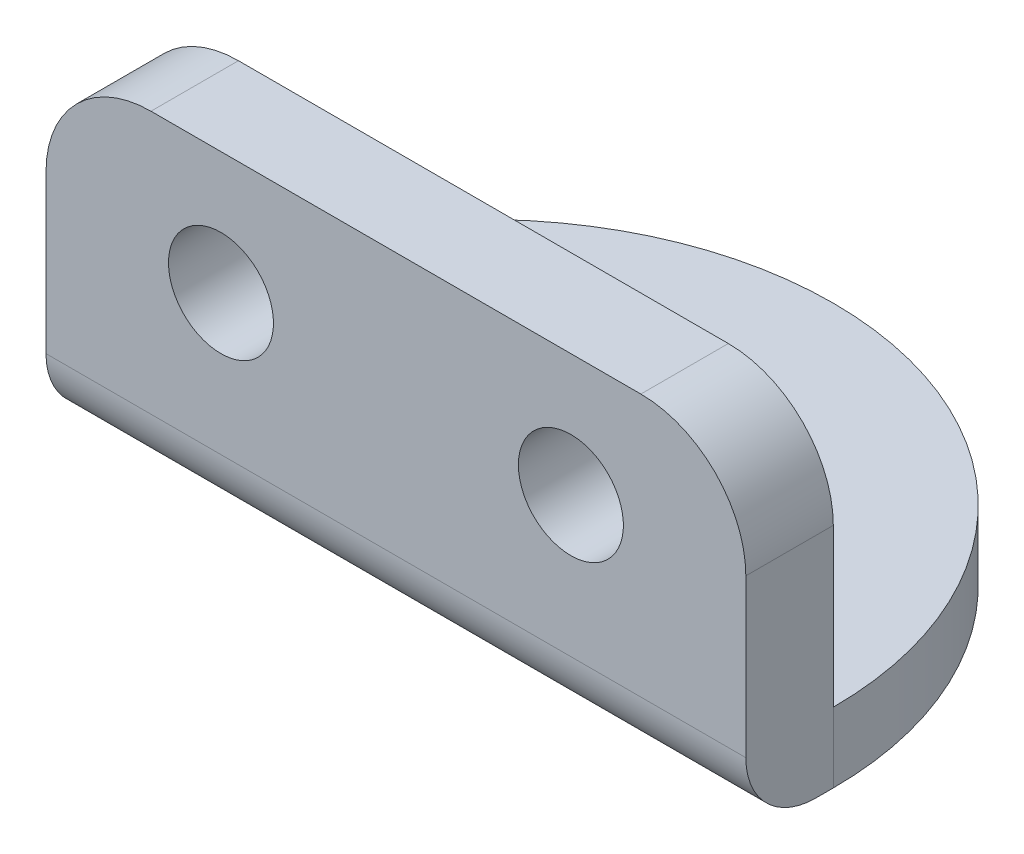
ISO-10303-21;
HEADER;
FILE_DESCRIPTION(('STEP AP214'),'2;1');
FILE_NAME('part.step','',(''),(''),'','','');
FILE_SCHEMA(('AUTOMOTIVE_DESIGN { 1 0 10303 214 1 1 1 1 }'));
ENDSEC;
DATA;
#1=APPLICATION_CONTEXT('core data for automotive mechanical design processes');
#2=APPLICATION_PROTOCOL_DEFINITION('international standard','automotive_design',2000,#1);
#3=PRODUCT_CONTEXT('',#1,'mechanical');
#4=PRODUCT('Part','Part','',(#3));
#5=PRODUCT_RELATED_PRODUCT_CATEGORY('part','',(#4));
#6=PRODUCT_DEFINITION_FORMATION('','',#4);
#7=PRODUCT_DEFINITION_CONTEXT('part definition',#1,'design');
#8=PRODUCT_DEFINITION('design','',#6,#7);
#9=PRODUCT_DEFINITION_SHAPE('','',#8);
#10=(LENGTH_UNIT() NAMED_UNIT(*) SI_UNIT(.MILLI.,.METRE.));
#11=(NAMED_UNIT(*) PLANE_ANGLE_UNIT() SI_UNIT($,.RADIAN.));
#12=(NAMED_UNIT(*) SI_UNIT($,.STERADIAN.) SOLID_ANGLE_UNIT());
#13=UNCERTAINTY_MEASURE_WITH_UNIT(LENGTH_MEASURE(1.E-05),#10,'distance_accuracy_value','');
#14=(GEOMETRIC_REPRESENTATION_CONTEXT(3) GLOBAL_UNCERTAINTY_ASSIGNED_CONTEXT((#13)) GLOBAL_UNIT_ASSIGNED_CONTEXT((#10,
#11,#12)) REPRESENTATION_CONTEXT('',''));
#15=CARTESIAN_POINT('',(0.,0.,0.));
#16=DIRECTION('',(0.,0.,1.));
#17=DIRECTION('',(1.,0.,0.));
#18=AXIS2_PLACEMENT_3D('',#15,#16,#17);
#19=CARTESIAN_POINT('',(0.,2.,0.));
#20=DIRECTION('',(0.,-1.,0.));
#21=DIRECTION('',(0.,0.,-1.));
#22=AXIS2_PLACEMENT_3D('',#19,#20,#21);
#23=CYLINDRICAL_SURFACE('',#22,1.5);
#24=CARTESIAN_POINT('',(0.,2.,0.));
#25=DIRECTION('',(0.,1.,0.));
#26=DIRECTION('',(0.,0.,1.));
#27=AXIS2_PLACEMENT_3D('',#24,#25,#26);
#28=CIRCLE('',#27,1.5);
#29=CARTESIAN_POINT('',(0.,2.,1.5));
#30=VERTEX_POINT('',#29);
#31=EDGE_CURVE('E129',#30,#30,#28,.T.);
#32=ORIENTED_EDGE('',*,*,#31,.T.);
#33=EDGE_LOOP('',(#32));
#34=FACE_BOUND('',#33,.T.);
#35=CARTESIAN_POINT('',(0.,0.,0.));
#36=DIRECTION('',(0.,1.,0.));
#37=DIRECTION('',(0.,0.,1.));
#38=AXIS2_PLACEMENT_3D('',#35,#36,#37);
#39=CIRCLE('',#38,1.5);
#40=CARTESIAN_POINT('',(0.,0.,1.5));
#41=VERTEX_POINT('',#40);
#42=EDGE_CURVE('E130',#41,#41,#39,.T.);
#43=ORIENTED_EDGE('',*,*,#42,.F.);
#44=EDGE_LOOP('',(#43));
#45=FACE_BOUND('',#44,.T.);
#46=ADVANCED_FACE('F41',(#34,#45),#23,.F.);
#47=CARTESIAN_POINT('',(-2.40947920630197E-13,2.,3.23));
#48=DIRECTION('',(0.,-1.,0.));
#49=DIRECTION('',(0.,0.,-1.));
#50=AXIS2_PLACEMENT_3D('',#47,#48,#49);
#51=CYLINDRICAL_SURFACE('',#50,10.0000000000001);
#52=CARTESIAN_POINT('',(-2.40947920630197E-13,0.,3.23));
#53=DIRECTION('',(0.,1.,0.));
#54=DIRECTION('',(0.,0.,1.));
#55=AXIS2_PLACEMENT_3D('',#52,#53,#54);
#56=CIRCLE('',#55,10.0000000000001);
#57=CARTESIAN_POINT('',(10.0000000000001,0.,3.23));
#58=VERTEX_POINT('',#57);
#59=CARTESIAN_POINT('',(-10.0000000000001,0.,3.23));
#60=VERTEX_POINT('',#59);
#61=EDGE_CURVE('E118',#58,#60,#56,.T.);
#62=ORIENTED_EDGE('',*,*,#61,.T.);
#63=DIRECTION('',(0.,-1.,0.));
#64=VECTOR('',#63,1.);
#65=CARTESIAN_POINT('',(-10.0000000000001,2.,3.23));
#66=LINE('',#65,#64);
#67=CARTESIAN_POINT('',(-10.0000000000001,2.,3.23));
#68=VERTEX_POINT('',#67);
#69=EDGE_CURVE('E125',#68,#60,#66,.T.);
#70=ORIENTED_EDGE('',*,*,#69,.F.);
#71=CARTESIAN_POINT('',(-2.40947920630197E-13,2.,3.23));
#72=DIRECTION('',(0.,1.,0.));
#73=DIRECTION('',(0.,0.,1.));
#74=AXIS2_PLACEMENT_3D('',#71,#72,#73);
#75=CIRCLE('',#74,10.0000000000001);
#76=CARTESIAN_POINT('',(10.0000000000001,2.,3.23));
#77=VERTEX_POINT('',#76);
#78=EDGE_CURVE('E121',#77,#68,#75,.T.);
#79=ORIENTED_EDGE('',*,*,#78,.F.);
#80=DIRECTION('',(0.,-1.,0.));
#81=VECTOR('',#80,1.);
#82=CARTESIAN_POINT('',(10.0000000000001,2.,3.23));
#83=LINE('',#82,#81);
#84=EDGE_CURVE('E108',#77,#58,#83,.T.);
#85=ORIENTED_EDGE('',*,*,#84,.T.);
#86=EDGE_LOOP('',(#62,#70,#79,#85));
#87=FACE_BOUND('',#86,.T.);
#88=ADVANCED_FACE('F116',(#87),#51,.T.);
#89=CARTESIAN_POINT('',(0.,2.,0.));
#90=DIRECTION('',(0.,1.,0.));
#91=DIRECTION('',(0.,0.,1.));
#92=AXIS2_PLACEMENT_3D('',#89,#90,#91);
#93=PLANE('',#92);
#94=ORIENTED_EDGE('',*,*,#31,.F.);
#95=EDGE_LOOP('',(#94));
#96=FACE_BOUND('',#95,.T.);
#97=DIRECTION('',(1.,0.,0.));
#98=VECTOR('',#97,1.);
#99=CARTESIAN_POINT('',(0.,2.,3.23));
#100=LINE('',#99,#98);
#101=EDGE_CURVE('E135',#68,#77,#100,.T.);
#102=ORIENTED_EDGE('',*,*,#101,.T.);
#103=ORIENTED_EDGE('',*,*,#78,.T.);
#104=EDGE_LOOP('',(#102,#103));
#105=FACE_BOUND('',#104,.T.);
#106=ADVANCED_FACE('F269',(#96,#105),#93,.T.);
#107=CARTESIAN_POINT('',(0.,0.,0.));
#108=DIRECTION('',(0.,1.,0.));
#109=DIRECTION('',(0.,0.,1.));
#110=AXIS2_PLACEMENT_3D('',#107,#108,#109);
#111=PLANE('',#110);
#112=ORIENTED_EDGE('',*,*,#42,.T.);
#113=EDGE_LOOP('',(#112));
#114=FACE_BOUND('',#113,.T.);
#115=DIRECTION('',(0.,0.,-1.));
#116=VECTOR('',#115,1.);
#117=CARTESIAN_POINT('',(10.0000000000001,0.,0.));
#118=LINE('',#117,#116);
#119=CARTESIAN_POINT('',(10.0000000000001,0.,3.73));
#120=VERTEX_POINT('',#119);
#121=EDGE_CURVE('E104',#120,#58,#118,.T.);
#122=ORIENTED_EDGE('',*,*,#121,.F.);
#123=DIRECTION('',(1.,0.,0.));
#124=VECTOR('',#123,1.);
#125=CARTESIAN_POINT('',(0.,0.,3.73));
#126=LINE('',#125,#124);
#127=CARTESIAN_POINT('',(-10.0000000000001,0.,3.73));
#128=VERTEX_POINT('',#127);
#129=EDGE_CURVE('E50',#120,#128,#126,.F.);
#130=ORIENTED_EDGE('',*,*,#129,.T.);
#131=DIRECTION('',(0.,0.,1.));
#132=VECTOR('',#131,1.);
#133=CARTESIAN_POINT('',(-10.0000000000001,0.,0.));
#134=LINE('',#133,#132);
#135=EDGE_CURVE('E112',#60,#128,#134,.T.);
#136=ORIENTED_EDGE('',*,*,#135,.F.);
#137=ORIENTED_EDGE('',*,*,#61,.F.);
#138=EDGE_LOOP('',(#122,#130,#136,#137));
#139=FACE_BOUND('',#138,.T.);
#140=ADVANCED_FACE('F127',(#114,#139),#111,.F.);
#141=CARTESIAN_POINT('',(0.,9.5,3.23));
#142=DIRECTION('',(0.,0.,-1.));
#143=DIRECTION('',(-1.,0.,0.));
#144=AXIS2_PLACEMENT_3D('',#141,#142,#143);
#145=PLANE('',#144);
#146=CARTESIAN_POINT('',(-5.,6.00000000000001,3.23));
#147=DIRECTION('',(0.,0.,-1.));
#148=DIRECTION('',(-1.,0.,0.));
#149=AXIS2_PLACEMENT_3D('',#146,#147,#148);
#150=CIRCLE('',#149,1.5);
#151=CARTESIAN_POINT('',(-6.5,6.00000000000001,3.23));
#152=VERTEX_POINT('',#151);
#153=EDGE_CURVE('E211',#152,#152,#150,.T.);
#154=ORIENTED_EDGE('',*,*,#153,.F.);
#155=EDGE_LOOP('',(#154));
#156=FACE_BOUND('',#155,.T.);
#157=CARTESIAN_POINT('',(5.,6.00000000000001,3.23));
#158=DIRECTION('',(0.,0.,-1.));
#159=DIRECTION('',(-1.,0.,0.));
#160=AXIS2_PLACEMENT_3D('',#157,#158,#159);
#161=CIRCLE('',#160,1.5);
#162=CARTESIAN_POINT('',(3.5,6.00000000000001,3.23));
#163=VERTEX_POINT('',#162);
#164=EDGE_CURVE('E203',#163,#163,#161,.T.);
#165=ORIENTED_EDGE('',*,*,#164,.F.);
#166=EDGE_LOOP('',(#165));
#167=FACE_BOUND('',#166,.T.);
#168=DIRECTION('',(1.,0.,0.));
#169=VECTOR('',#168,1.);
#170=CARTESIAN_POINT('',(0.,9.5,3.23));
#171=LINE('',#170,#169);
#172=CARTESIAN_POINT('',(-7.00000000000011,9.5,3.23));
#173=VERTEX_POINT('',#172);
#174=CARTESIAN_POINT('',(7.00000000000011,9.5,3.23));
#175=VERTEX_POINT('',#174);
#176=EDGE_CURVE('E111',#173,#175,#171,.T.);
#177=ORIENTED_EDGE('',*,*,#176,.T.);
#178=CARTESIAN_POINT('',(7.00000000000011,6.5,3.23));
#179=DIRECTION('',(0.,0.,-1.));
#180=DIRECTION('',(-1.,0.,0.));
#181=AXIS2_PLACEMENT_3D('',#178,#179,#180);
#182=CIRCLE('',#181,3.);
#183=CARTESIAN_POINT('',(10.0000000000001,6.5,3.23));
#184=VERTEX_POINT('',#183);
#185=EDGE_CURVE('E154',#175,#184,#182,.T.);
#186=ORIENTED_EDGE('',*,*,#185,.T.);
#187=DIRECTION('',(0.,-1.,0.));
#188=VECTOR('',#187,1.);
#189=CARTESIAN_POINT('',(10.0000000000001,9.5,3.23));
#190=LINE('',#189,#188);
#191=EDGE_CURVE('E190',#184,#77,#190,.T.);
#192=ORIENTED_EDGE('',*,*,#191,.T.);
#193=ORIENTED_EDGE('',*,*,#101,.F.);
#194=DIRECTION('',(0.,-1.,0.));
#195=VECTOR('',#194,1.);
#196=CARTESIAN_POINT('',(-10.0000000000001,9.5,3.23));
#197=LINE('',#196,#195);
#198=CARTESIAN_POINT('',(-10.0000000000001,6.5,3.23));
#199=VERTEX_POINT('',#198);
#200=EDGE_CURVE('E138',#199,#68,#197,.T.);
#201=ORIENTED_EDGE('',*,*,#200,.F.);
#202=CARTESIAN_POINT('',(-7.00000000000011,6.5,3.23));
#203=DIRECTION('',(0.,0.,-1.));
#204=DIRECTION('',(-1.,0.,0.));
#205=AXIS2_PLACEMENT_3D('',#202,#203,#204);
#206=CIRCLE('',#205,3.);
#207=EDGE_CURVE('E151',#199,#173,#206,.T.);
#208=ORIENTED_EDGE('',*,*,#207,.T.);
#209=EDGE_LOOP('',(#177,#186,#192,#193,#201,#208));
#210=FACE_BOUND('',#209,.T.);
#211=ADVANCED_FACE('F230',(#156,#167,#210),#145,.T.);
#212=CARTESIAN_POINT('',(-10.0000000000001,9.5,0.));
#213=DIRECTION('',(1.,0.,0.));
#214=DIRECTION('',(0.,0.,-1.));
#215=AXIS2_PLACEMENT_3D('',#212,#213,#214);
#216=PLANE('',#215);
#217=ORIENTED_EDGE('',*,*,#135,.T.);
#218=CARTESIAN_POINT('',(-10.0000000000001,2.,3.73));
#219=DIRECTION('',(1.,0.,0.));
#220=DIRECTION('',(0.,0.,-1.));
#221=AXIS2_PLACEMENT_3D('',#218,#219,#220);
#222=CIRCLE('',#221,2.);
#223=CARTESIAN_POINT('',(-10.0000000000001,2.,5.73));
#224=VERTEX_POINT('',#223);
#225=EDGE_CURVE('E11',#128,#224,#222,.F.);
#226=ORIENTED_EDGE('',*,*,#225,.T.);
#227=DIRECTION('',(0.,-1.,0.));
#228=VECTOR('',#227,1.);
#229=CARTESIAN_POINT('',(-10.0000000000001,9.5,5.73));
#230=LINE('',#229,#228);
#231=CARTESIAN_POINT('',(-10.0000000000001,6.5,5.73));
#232=VERTEX_POINT('',#231);
#233=EDGE_CURVE('E183',#232,#224,#230,.T.);
#234=ORIENTED_EDGE('',*,*,#233,.F.);
#235=DIRECTION('',(0.,0.,1.));
#236=VECTOR('',#235,1.);
#237=CARTESIAN_POINT('',(-10.0000000000001,6.5,3.23));
#238=LINE('',#237,#236);
#239=EDGE_CURVE('E166',#232,#199,#238,.F.);
#240=ORIENTED_EDGE('',*,*,#239,.T.);
#241=ORIENTED_EDGE('',*,*,#200,.T.);
#242=ORIENTED_EDGE('',*,*,#69,.T.);
#243=EDGE_LOOP('',(#217,#226,#234,#240,#241,#242));
#244=FACE_BOUND('',#243,.T.);
#245=ADVANCED_FACE('F233',(#244),#216,.F.);
#246=CARTESIAN_POINT('',(0.,9.5,5.73));
#247=DIRECTION('',(0.,0.,-1.));
#248=DIRECTION('',(-1.,0.,0.));
#249=AXIS2_PLACEMENT_3D('',#246,#247,#248);
#250=PLANE('',#249);
#251=CARTESIAN_POINT('',(-5.,6.00000000000001,5.73));
#252=DIRECTION('',(0.,0.,-1.));
#253=DIRECTION('',(-1.,0.,0.));
#254=AXIS2_PLACEMENT_3D('',#251,#252,#253);
#255=CIRCLE('',#254,1.5);
#256=CARTESIAN_POINT('',(-6.5,6.00000000000001,5.73));
#257=VERTEX_POINT('',#256);
#258=EDGE_CURVE('E196',#257,#257,#255,.T.);
#259=ORIENTED_EDGE('',*,*,#258,.T.);
#260=EDGE_LOOP('',(#259));
#261=FACE_BOUND('',#260,.T.);
#262=CARTESIAN_POINT('',(5.,6.00000000000001,5.73));
#263=DIRECTION('',(0.,0.,-1.));
#264=DIRECTION('',(-1.,0.,0.));
#265=AXIS2_PLACEMENT_3D('',#262,#263,#264);
#266=CIRCLE('',#265,1.5);
#267=CARTESIAN_POINT('',(3.5,6.00000000000001,5.73));
#268=VERTEX_POINT('',#267);
#269=EDGE_CURVE('E207',#268,#268,#266,.T.);
#270=ORIENTED_EDGE('',*,*,#269,.T.);
#271=EDGE_LOOP('',(#270));
#272=FACE_BOUND('',#271,.T.);
#273=ORIENTED_EDGE('',*,*,#233,.T.);
#274=DIRECTION('',(1.,0.,0.));
#275=VECTOR('',#274,1.);
#276=CARTESIAN_POINT('',(0.,2.,5.73));
#277=LINE('',#276,#275);
#278=CARTESIAN_POINT('',(10.0000000000001,2.,5.73));
#279=VERTEX_POINT('',#278);
#280=EDGE_CURVE('E169',#224,#279,#277,.T.);
#281=ORIENTED_EDGE('',*,*,#280,.T.);
#282=DIRECTION('',(0.,-1.,0.));
#283=VECTOR('',#282,1.);
#284=CARTESIAN_POINT('',(10.0000000000001,9.5,5.73));
#285=LINE('',#284,#283);
#286=CARTESIAN_POINT('',(10.0000000000001,6.5,5.73));
#287=VERTEX_POINT('',#286);
#288=EDGE_CURVE('E187',#287,#279,#285,.T.);
#289=ORIENTED_EDGE('',*,*,#288,.F.);
#290=CARTESIAN_POINT('',(7.00000000000011,6.5,5.73));
#291=DIRECTION('',(0.,0.,-1.));
#292=DIRECTION('',(-1.,0.,0.));
#293=AXIS2_PLACEMENT_3D('',#290,#291,#292);
#294=CIRCLE('',#293,3.);
#295=CARTESIAN_POINT('',(7.00000000000011,9.5,5.73));
#296=VERTEX_POINT('',#295);
#297=EDGE_CURVE('E163',#287,#296,#294,.F.);
#298=ORIENTED_EDGE('',*,*,#297,.T.);
#299=DIRECTION('',(1.,0.,0.));
#300=VECTOR('',#299,1.);
#301=CARTESIAN_POINT('',(0.,9.5,5.73));
#302=LINE('',#301,#300);
#303=CARTESIAN_POINT('',(-7.00000000000011,9.5,5.73));
#304=VERTEX_POINT('',#303);
#305=EDGE_CURVE('E192',#304,#296,#302,.T.);
#306=ORIENTED_EDGE('',*,*,#305,.F.);
#307=CARTESIAN_POINT('',(-7.00000000000011,6.5,5.73));
#308=DIRECTION('',(0.,0.,-1.));
#309=DIRECTION('',(-1.,0.,0.));
#310=AXIS2_PLACEMENT_3D('',#307,#308,#309);
#311=CIRCLE('',#310,3.);
#312=EDGE_CURVE('E160',#304,#232,#311,.F.);
#313=ORIENTED_EDGE('',*,*,#312,.T.);
#314=EDGE_LOOP('',(#273,#281,#289,#298,#306,#313));
#315=FACE_BOUND('',#314,.T.);
#316=ADVANCED_FACE('F219',(#261,#272,#315),#250,.F.);
#317=CARTESIAN_POINT('',(10.0000000000001,9.5,0.));
#318=DIRECTION('',(-1.,0.,0.));
#319=DIRECTION('',(0.,0.,1.));
#320=AXIS2_PLACEMENT_3D('',#317,#318,#319);
#321=PLANE('',#320);
#322=ORIENTED_EDGE('',*,*,#288,.T.);
#323=CARTESIAN_POINT('',(10.0000000000001,2.,3.73));
#324=DIRECTION('',(-1.,0.,0.));
#325=DIRECTION('',(0.,0.,1.));
#326=AXIS2_PLACEMENT_3D('',#323,#324,#325);
#327=CIRCLE('',#326,2.);
#328=EDGE_CURVE('E64',#279,#120,#327,.F.);
#329=ORIENTED_EDGE('',*,*,#328,.T.);
#330=ORIENTED_EDGE('',*,*,#121,.T.);
#331=ORIENTED_EDGE('',*,*,#84,.F.);
#332=ORIENTED_EDGE('',*,*,#191,.F.);
#333=DIRECTION('',(0.,0.,-1.));
#334=VECTOR('',#333,1.);
#335=CARTESIAN_POINT('',(10.0000000000001,6.5,5.73));
#336=LINE('',#335,#334);
#337=EDGE_CURVE('E157',#184,#287,#336,.F.);
#338=ORIENTED_EDGE('',*,*,#337,.T.);
#339=EDGE_LOOP('',(#322,#329,#330,#331,#332,#338));
#340=FACE_BOUND('',#339,.T.);
#341=ADVANCED_FACE('F106',(#340),#321,.F.);
#342=CARTESIAN_POINT('',(0.,9.5,0.));
#343=DIRECTION('',(0.,1.,0.));
#344=DIRECTION('',(0.,0.,1.));
#345=AXIS2_PLACEMENT_3D('',#342,#343,#344);
#346=PLANE('',#345);
#347=ORIENTED_EDGE('',*,*,#305,.T.);
#348=DIRECTION('',(0.,0.,-1.));
#349=VECTOR('',#348,1.);
#350=CARTESIAN_POINT('',(7.00000000000011,9.5,3.23));
#351=LINE('',#350,#349);
#352=EDGE_CURVE('E147',#296,#175,#351,.T.);
#353=ORIENTED_EDGE('',*,*,#352,.T.);
#354=ORIENTED_EDGE('',*,*,#176,.F.);
#355=DIRECTION('',(0.,0.,1.));
#356=VECTOR('',#355,1.);
#357=CARTESIAN_POINT('',(-7.00000000000011,9.5,5.73));
#358=LINE('',#357,#356);
#359=EDGE_CURVE('E124',#173,#304,#358,.T.);
#360=ORIENTED_EDGE('',*,*,#359,.T.);
#361=EDGE_LOOP('',(#347,#353,#354,#360));
#362=FACE_BOUND('',#361,.T.);
#363=ADVANCED_FACE('F242',(#362),#346,.T.);
#364=CARTESIAN_POINT('',(5.,6.00000000000001,5.73));
#365=DIRECTION('',(0.,0.,-1.));
#366=DIRECTION('',(-1.,0.,0.));
#367=AXIS2_PLACEMENT_3D('',#364,#365,#366);
#368=CYLINDRICAL_SURFACE('',#367,1.5);
#369=ORIENTED_EDGE('',*,*,#269,.F.);
#370=EDGE_LOOP('',(#369));
#371=FACE_BOUND('',#370,.T.);
#372=ORIENTED_EDGE('',*,*,#164,.T.);
#373=EDGE_LOOP('',(#372));
#374=FACE_BOUND('',#373,.T.);
#375=ADVANCED_FACE('F226',(#371,#374),#368,.F.);
#376=CARTESIAN_POINT('',(-5.,6.00000000000001,5.73));
#377=DIRECTION('',(0.,0.,-1.));
#378=DIRECTION('',(-1.,0.,0.));
#379=AXIS2_PLACEMENT_3D('',#376,#377,#378);
#380=CYLINDRICAL_SURFACE('',#379,1.5);
#381=ORIENTED_EDGE('',*,*,#258,.F.);
#382=EDGE_LOOP('',(#381));
#383=FACE_BOUND('',#382,.T.);
#384=ORIENTED_EDGE('',*,*,#153,.T.);
#385=EDGE_LOOP('',(#384));
#386=FACE_BOUND('',#385,.T.);
#387=ADVANCED_FACE('F222',(#383,#386),#380,.F.);
#388=CARTESIAN_POINT('',(7.00000000000011,6.5,0.));
#389=DIRECTION('',(0.,0.,1.));
#390=DIRECTION('',(1.,0.,0.));
#391=AXIS2_PLACEMENT_3D('',#388,#389,#390);
#392=CYLINDRICAL_SURFACE('',#391,3.);
#393=ORIENTED_EDGE('',*,*,#297,.F.);
#394=ORIENTED_EDGE('',*,*,#337,.F.);
#395=ORIENTED_EDGE('',*,*,#185,.F.);
#396=ORIENTED_EDGE('',*,*,#352,.F.);
#397=EDGE_LOOP('',(#393,#394,#395,#396));
#398=FACE_BOUND('',#397,.T.);
#399=ADVANCED_FACE('F225',(#398),#392,.T.);
#400=CARTESIAN_POINT('',(-7.00000000000011,6.5,0.));
#401=DIRECTION('',(0.,0.,-1.));
#402=DIRECTION('',(-1.,0.,0.));
#403=AXIS2_PLACEMENT_3D('',#400,#401,#402);
#404=CYLINDRICAL_SURFACE('',#403,3.);
#405=ORIENTED_EDGE('',*,*,#207,.F.);
#406=ORIENTED_EDGE('',*,*,#239,.F.);
#407=ORIENTED_EDGE('',*,*,#312,.F.);
#408=ORIENTED_EDGE('',*,*,#359,.F.);
#409=EDGE_LOOP('',(#405,#406,#407,#408));
#410=FACE_BOUND('',#409,.T.);
#411=ADVANCED_FACE('F246',(#410),#404,.T.);
#412=CARTESIAN_POINT('',(0.,2.,3.73));
#413=DIRECTION('',(1.,0.,0.));
#414=DIRECTION('',(0.,0.,-1.));
#415=AXIS2_PLACEMENT_3D('',#412,#413,#414);
#416=CYLINDRICAL_SURFACE('',#415,2.);
#417=ORIENTED_EDGE('',*,*,#225,.F.);
#418=ORIENTED_EDGE('',*,*,#129,.F.);
#419=ORIENTED_EDGE('',*,*,#328,.F.);
#420=ORIENTED_EDGE('',*,*,#280,.F.);
#421=EDGE_LOOP('',(#417,#418,#419,#420));
#422=FACE_BOUND('',#421,.T.);
#423=ADVANCED_FACE('F43',(#422),#416,.T.);
#424=CLOSED_SHELL('',(#46,#88,#106,#140,#211,#245,#316,#341,#363,#375,#387,#399,#411,#423));
#425=MANIFOLD_SOLID_BREP('B2',#424);
#426=ADVANCED_BREP_SHAPE_REPRESENTATION('',(#18,#425),#14);
#427=SHAPE_DEFINITION_REPRESENTATION(#9,#426);
ENDSEC;
END-ISO-10303-21;
